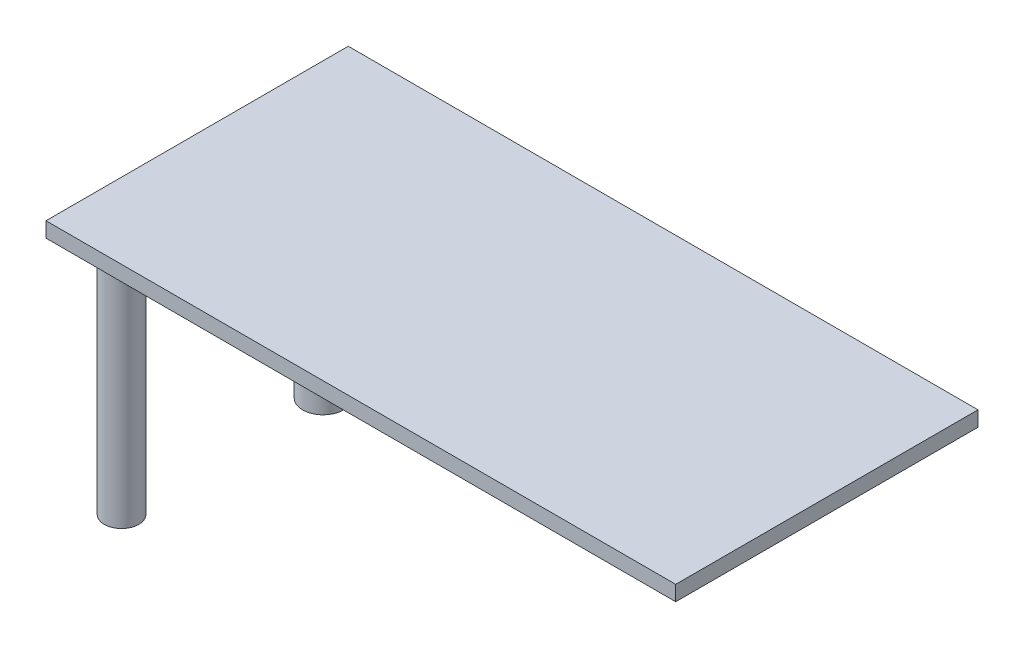
ISO-10303-21;
HEADER;
FILE_DESCRIPTION(('STEP AP214'),'2;1');
FILE_NAME('part.step','',(''),(''),'','','');
FILE_SCHEMA(('AUTOMOTIVE_DESIGN { 1 0 10303 214 1 1 1 1 }'));
ENDSEC;
DATA;
#1=APPLICATION_CONTEXT('core data for automotive mechanical design processes');
#2=APPLICATION_PROTOCOL_DEFINITION('international standard','automotive_design',2000,#1);
#3=PRODUCT_CONTEXT('',#1,'mechanical');
#4=PRODUCT('Part','Part','',(#3));
#5=PRODUCT_RELATED_PRODUCT_CATEGORY('part','',(#4));
#6=PRODUCT_DEFINITION_FORMATION('','',#4);
#7=PRODUCT_DEFINITION_CONTEXT('part definition',#1,'design');
#8=PRODUCT_DEFINITION('design','',#6,#7);
#9=PRODUCT_DEFINITION_SHAPE('','',#8);
#10=(LENGTH_UNIT() NAMED_UNIT(*) SI_UNIT(.MILLI.,.METRE.));
#11=(NAMED_UNIT(*) PLANE_ANGLE_UNIT() SI_UNIT($,.RADIAN.));
#12=(NAMED_UNIT(*) SI_UNIT($,.STERADIAN.) SOLID_ANGLE_UNIT());
#13=UNCERTAINTY_MEASURE_WITH_UNIT(LENGTH_MEASURE(1.E-05),#10,'distance_accuracy_value','');
#14=(GEOMETRIC_REPRESENTATION_CONTEXT(3) GLOBAL_UNCERTAINTY_ASSIGNED_CONTEXT((#13)) GLOBAL_UNIT_ASSIGNED_CONTEXT((#10,
#11,#12)) REPRESENTATION_CONTEXT('',''));
#15=CARTESIAN_POINT('',(0.,0.,0.));
#16=DIRECTION('',(0.,0.,1.));
#17=DIRECTION('',(1.,0.,0.));
#18=AXIS2_PLACEMENT_3D('',#15,#16,#17);
#19=CARTESIAN_POINT('',(0.,3.,0.));
#20=DIRECTION('',(1.,0.,0.));
#21=DIRECTION('',(0.,0.,-1.));
#22=AXIS2_PLACEMENT_3D('',#19,#20,#21);
#23=PLANE('',#22);
#24=DIRECTION('',(0.,0.,1.));
#25=VECTOR('',#24,1.);
#26=CARTESIAN_POINT('',(0.,0.,0.));
#27=LINE('',#26,#25);
#28=CARTESIAN_POINT('',(0.,0.,-60.));
#29=VERTEX_POINT('',#28);
#30=CARTESIAN_POINT('',(0.,0.,0.));
#31=VERTEX_POINT('',#30);
#32=EDGE_CURVE('E96',#29,#31,#27,.T.);
#33=ORIENTED_EDGE('',*,*,#32,.T.);
#34=DIRECTION('',(0.,-1.,0.));
#35=VECTOR('',#34,1.);
#36=CARTESIAN_POINT('',(0.,3.,0.));
#37=LINE('',#36,#35);
#38=CARTESIAN_POINT('',(0.,3.,0.));
#39=VERTEX_POINT('',#38);
#40=EDGE_CURVE('E11',#39,#31,#37,.T.);
#41=ORIENTED_EDGE('',*,*,#40,.F.);
#42=DIRECTION('',(0.,0.,1.));
#43=VECTOR('',#42,1.);
#44=CARTESIAN_POINT('',(0.,3.,0.));
#45=LINE('',#44,#43);
#46=CARTESIAN_POINT('',(0.,3.,-60.));
#47=VERTEX_POINT('',#46);
#48=EDGE_CURVE('E84',#47,#39,#45,.T.);
#49=ORIENTED_EDGE('',*,*,#48,.F.);
#50=DIRECTION('',(0.,-1.,0.));
#51=VECTOR('',#50,1.);
#52=CARTESIAN_POINT('',(0.,3.,-60.));
#53=LINE('',#52,#51);
#54=EDGE_CURVE('E92',#47,#29,#53,.T.);
#55=ORIENTED_EDGE('',*,*,#54,.T.);
#56=EDGE_LOOP('',(#33,#41,#49,#55));
#57=FACE_BOUND('',#56,.T.);
#58=ADVANCED_FACE('F33',(#57),#23,.F.);
#59=CARTESIAN_POINT('',(0.,3.,0.));
#60=DIRECTION('',(0.,0.,-1.));
#61=DIRECTION('',(-1.,0.,0.));
#62=AXIS2_PLACEMENT_3D('',#59,#60,#61);
#63=PLANE('',#62);
#64=DIRECTION('',(1.,0.,0.));
#65=VECTOR('',#64,1.);
#66=CARTESIAN_POINT('',(0.,0.,0.));
#67=LINE('',#66,#65);
#68=CARTESIAN_POINT('',(125.,0.,0.));
#69=VERTEX_POINT('',#68);
#70=EDGE_CURVE('E88',#31,#69,#67,.T.);
#71=ORIENTED_EDGE('',*,*,#70,.T.);
#72=DIRECTION('',(0.,-1.,0.));
#73=VECTOR('',#72,1.);
#74=CARTESIAN_POINT('',(125.,3.,0.));
#75=LINE('',#74,#73);
#76=CARTESIAN_POINT('',(125.,3.,0.));
#77=VERTEX_POINT('',#76);
#78=EDGE_CURVE('E41',#77,#69,#75,.T.);
#79=ORIENTED_EDGE('',*,*,#78,.F.);
#80=DIRECTION('',(1.,0.,0.));
#81=VECTOR('',#80,1.);
#82=CARTESIAN_POINT('',(0.,3.,0.));
#83=LINE('',#82,#81);
#84=EDGE_CURVE('E79',#39,#77,#83,.T.);
#85=ORIENTED_EDGE('',*,*,#84,.F.);
#86=ORIENTED_EDGE('',*,*,#40,.T.);
#87=EDGE_LOOP('',(#71,#79,#85,#86));
#88=FACE_BOUND('',#87,.T.);
#89=ADVANCED_FACE('F87',(#88),#63,.F.);
#90=CARTESIAN_POINT('',(125.,3.,0.));
#91=DIRECTION('',(-1.,0.,0.));
#92=DIRECTION('',(0.,0.,1.));
#93=AXIS2_PLACEMENT_3D('',#90,#91,#92);
#94=PLANE('',#93);
#95=DIRECTION('',(0.,0.,-1.));
#96=VECTOR('',#95,1.);
#97=CARTESIAN_POINT('',(125.,0.,0.));
#98=LINE('',#97,#96);
#99=CARTESIAN_POINT('',(125.,0.,-60.));
#100=VERTEX_POINT('',#99);
#101=EDGE_CURVE('E66',#69,#100,#98,.T.);
#102=ORIENTED_EDGE('',*,*,#101,.T.);
#103=DIRECTION('',(0.,-1.,0.));
#104=VECTOR('',#103,1.);
#105=CARTESIAN_POINT('',(125.,3.,-60.));
#106=LINE('',#105,#104);
#107=CARTESIAN_POINT('',(125.,3.,-60.));
#108=VERTEX_POINT('',#107);
#109=EDGE_CURVE('E89',#108,#100,#106,.T.);
#110=ORIENTED_EDGE('',*,*,#109,.F.);
#111=DIRECTION('',(0.,0.,-1.));
#112=VECTOR('',#111,1.);
#113=CARTESIAN_POINT('',(125.,3.,0.));
#114=LINE('',#113,#112);
#115=EDGE_CURVE('E82',#77,#108,#114,.T.);
#116=ORIENTED_EDGE('',*,*,#115,.F.);
#117=ORIENTED_EDGE('',*,*,#78,.T.);
#118=EDGE_LOOP('',(#102,#110,#116,#117));
#119=FACE_BOUND('',#118,.T.);
#120=ADVANCED_FACE('F90',(#119),#94,.F.);
#121=CARTESIAN_POINT('',(0.,3.,-60.));
#122=DIRECTION('',(0.,0.,1.));
#123=DIRECTION('',(1.,0.,0.));
#124=AXIS2_PLACEMENT_3D('',#121,#122,#123);
#125=PLANE('',#124);
#126=DIRECTION('',(-1.,0.,0.));
#127=VECTOR('',#126,1.);
#128=CARTESIAN_POINT('',(0.,0.,-60.));
#129=LINE('',#128,#127);
#130=EDGE_CURVE('E72',#100,#29,#129,.T.);
#131=ORIENTED_EDGE('',*,*,#130,.T.);
#132=ORIENTED_EDGE('',*,*,#54,.F.);
#133=DIRECTION('',(-1.,0.,0.));
#134=VECTOR('',#133,1.);
#135=CARTESIAN_POINT('',(0.,3.,-60.));
#136=LINE('',#135,#134);
#137=EDGE_CURVE('E49',#108,#47,#136,.T.);
#138=ORIENTED_EDGE('',*,*,#137,.F.);
#139=ORIENTED_EDGE('',*,*,#109,.T.);
#140=EDGE_LOOP('',(#131,#132,#138,#139));
#141=FACE_BOUND('',#140,.T.);
#142=ADVANCED_FACE('F104',(#141),#125,.F.);
#143=CARTESIAN_POINT('',(0.,3.,0.));
#144=DIRECTION('',(0.,-1.,0.));
#145=DIRECTION('',(0.,0.,-1.));
#146=AXIS2_PLACEMENT_3D('',#143,#144,#145);
#147=PLANE('',#146);
#148=ORIENTED_EDGE('',*,*,#48,.T.);
#149=ORIENTED_EDGE('',*,*,#84,.T.);
#150=ORIENTED_EDGE('',*,*,#115,.T.);
#151=ORIENTED_EDGE('',*,*,#137,.T.);
#152=EDGE_LOOP('',(#148,#149,#150,#151));
#153=FACE_BOUND('',#152,.T.);
#154=ADVANCED_FACE('F80',(#153),#147,.F.);
#155=CARTESIAN_POINT('',(0.,0.,0.));
#156=DIRECTION('',(0.,-1.,0.));
#157=DIRECTION('',(0.,0.,-1.));
#158=AXIS2_PLACEMENT_3D('',#155,#156,#157);
#159=PLANE('',#158);
#160=CARTESIAN_POINT('',(5.00000000000001,0.,-50.));
#161=DIRECTION('',(0.,-1.,0.));
#162=DIRECTION('',(0.,0.,-1.));
#163=AXIS2_PLACEMENT_3D('',#160,#161,#162);
#164=CIRCLE('',#163,4.05436333426849);
#165=CARTESIAN_POINT('',(5.00000000000001,0.,-54.0543633342685));
#166=VERTEX_POINT('',#165);
#167=EDGE_CURVE('E116',#166,#166,#164,.T.);
#168=ORIENTED_EDGE('',*,*,#167,.F.);
#169=EDGE_LOOP('',(#168));
#170=FACE_BOUND('',#169,.T.);
#171=CARTESIAN_POINT('',(5.,0.,-10.));
#172=DIRECTION('',(0.,-1.,0.));
#173=DIRECTION('',(0.,0.,-1.));
#174=AXIS2_PLACEMENT_3D('',#171,#172,#173);
#175=CIRCLE('',#174,3.41996653073942);
#176=CARTESIAN_POINT('',(5.,0.,-13.4199665307394));
#177=VERTEX_POINT('',#176);
#178=EDGE_CURVE('E110',#177,#177,#175,.T.);
#179=ORIENTED_EDGE('',*,*,#178,.F.);
#180=EDGE_LOOP('',(#179));
#181=FACE_BOUND('',#180,.T.);
#182=ORIENTED_EDGE('',*,*,#32,.F.);
#183=ORIENTED_EDGE('',*,*,#130,.F.);
#184=ORIENTED_EDGE('',*,*,#101,.F.);
#185=ORIENTED_EDGE('',*,*,#70,.F.);
#186=EDGE_LOOP('',(#182,#183,#184,#185));
#187=FACE_BOUND('',#186,.T.);
#188=ADVANCED_FACE('F107',(#170,#181,#187),#159,.T.);
#189=CARTESIAN_POINT('',(5.,-50.,-10.));
#190=DIRECTION('',(0.,1.,0.));
#191=DIRECTION('',(0.,0.,1.));
#192=AXIS2_PLACEMENT_3D('',#189,#190,#191);
#193=CYLINDRICAL_SURFACE('',#192,3.41996653073942);
#194=CARTESIAN_POINT('',(5.,-50.,-10.));
#195=DIRECTION('',(0.,-1.,0.));
#196=DIRECTION('',(0.,0.,-1.));
#197=AXIS2_PLACEMENT_3D('',#194,#195,#196);
#198=CIRCLE('',#197,3.41996653073942);
#199=CARTESIAN_POINT('',(5.,-50.,-13.4199665307394));
#200=VERTEX_POINT('',#199);
#201=EDGE_CURVE('E99',#200,#200,#198,.T.);
#202=ORIENTED_EDGE('',*,*,#201,.F.);
#203=EDGE_LOOP('',(#202));
#204=FACE_BOUND('',#203,.T.);
#205=ORIENTED_EDGE('',*,*,#178,.T.);
#206=EDGE_LOOP('',(#205));
#207=FACE_BOUND('',#206,.T.);
#208=ADVANCED_FACE('F133',(#204,#207),#193,.T.);
#209=CARTESIAN_POINT('',(5.,-50.,-10.));
#210=DIRECTION('',(0.,-1.,0.));
#211=DIRECTION('',(0.,0.,-1.));
#212=AXIS2_PLACEMENT_3D('',#209,#210,#211);
#213=PLANE('',#212);
#214=ORIENTED_EDGE('',*,*,#201,.T.);
#215=EDGE_LOOP('',(#214));
#216=FACE_BOUND('',#215,.T.);
#217=ADVANCED_FACE('F127',(#216),#213,.T.);
#218=CARTESIAN_POINT('',(5.00000000000001,-50.,-50.));
#219=DIRECTION('',(0.,1.,0.));
#220=DIRECTION('',(0.,0.,1.));
#221=AXIS2_PLACEMENT_3D('',#218,#219,#220);
#222=CYLINDRICAL_SURFACE('',#221,4.05436333426849);
#223=CARTESIAN_POINT('',(5.00000000000001,-50.,-50.));
#224=DIRECTION('',(0.,-1.,0.));
#225=DIRECTION('',(0.,0.,-1.));
#226=AXIS2_PLACEMENT_3D('',#223,#224,#225);
#227=CIRCLE('',#226,4.05436333426849);
#228=CARTESIAN_POINT('',(5.00000000000001,-50.,-54.0543633342685));
#229=VERTEX_POINT('',#228);
#230=EDGE_CURVE('E113',#229,#229,#227,.T.);
#231=ORIENTED_EDGE('',*,*,#230,.F.);
#232=EDGE_LOOP('',(#231));
#233=FACE_BOUND('',#232,.T.);
#234=ORIENTED_EDGE('',*,*,#167,.T.);
#235=EDGE_LOOP('',(#234));
#236=FACE_BOUND('',#235,.T.);
#237=ADVANCED_FACE('F124',(#233,#236),#222,.T.);
#238=CARTESIAN_POINT('',(5.00000000000001,-50.,-50.));
#239=DIRECTION('',(0.,-1.,0.));
#240=DIRECTION('',(0.,0.,-1.));
#241=AXIS2_PLACEMENT_3D('',#238,#239,#240);
#242=PLANE('',#241);
#243=ORIENTED_EDGE('',*,*,#230,.T.);
#244=EDGE_LOOP('',(#243));
#245=FACE_BOUND('',#244,.T.);
#246=ADVANCED_FACE('F122',(#245),#242,.T.);
#247=CLOSED_SHELL('',(#58,#89,#120,#142,#154,#188,#208,#217,#237,#246));
#248=MANIFOLD_SOLID_BREP('B2',#247);
#249=ADVANCED_BREP_SHAPE_REPRESENTATION('',(#18,#248),#14);
#250=SHAPE_DEFINITION_REPRESENTATION(#9,#249);
ENDSEC;
END-ISO-10303-21;
